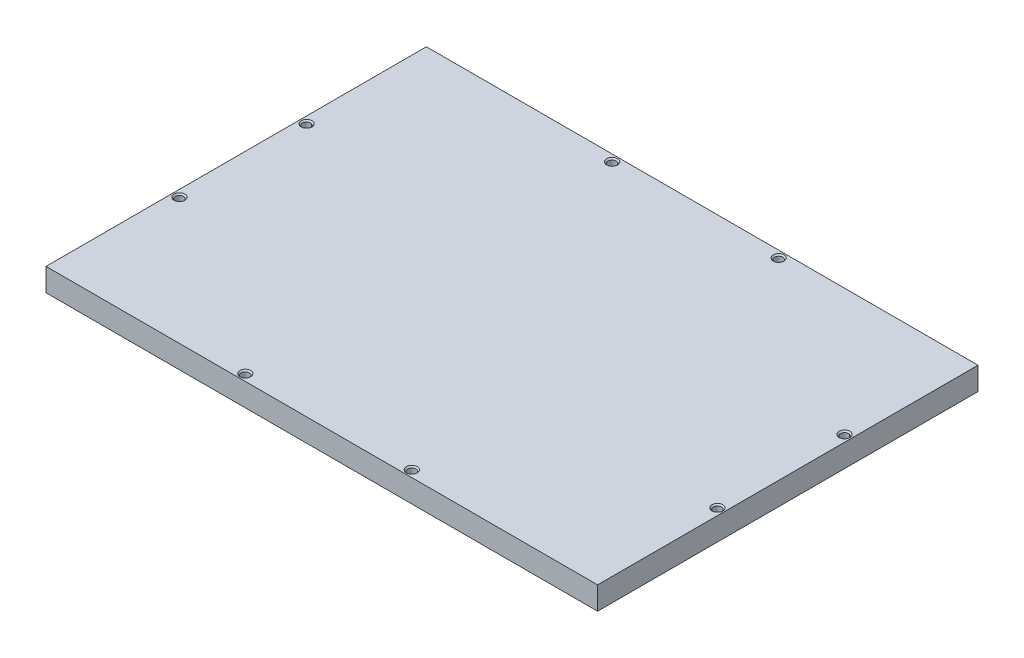
ISO-10303-21;
HEADER;
FILE_DESCRIPTION(('STEP AP214'),'2;1');
FILE_NAME('part.step','',(''),(''),'','','');
FILE_SCHEMA(('AUTOMOTIVE_DESIGN { 1 0 10303 214 1 1 1 1 }'));
ENDSEC;
DATA;
#1=APPLICATION_CONTEXT('core data for automotive mechanical design processes');
#2=APPLICATION_PROTOCOL_DEFINITION('international standard','automotive_design',2000,#1);
#3=PRODUCT_CONTEXT('',#1,'mechanical');
#4=PRODUCT('Part','Part','',(#3));
#5=PRODUCT_RELATED_PRODUCT_CATEGORY('part','',(#4));
#6=PRODUCT_DEFINITION_FORMATION('','',#4);
#7=PRODUCT_DEFINITION_CONTEXT('part definition',#1,'design');
#8=PRODUCT_DEFINITION('design','',#6,#7);
#9=PRODUCT_DEFINITION_SHAPE('','',#8);
#10=(LENGTH_UNIT() NAMED_UNIT(*) SI_UNIT(.MILLI.,.METRE.));
#11=(NAMED_UNIT(*) PLANE_ANGLE_UNIT() SI_UNIT($,.RADIAN.));
#12=(NAMED_UNIT(*) SI_UNIT($,.STERADIAN.) SOLID_ANGLE_UNIT());
#13=UNCERTAINTY_MEASURE_WITH_UNIT(LENGTH_MEASURE(1.E-05),#10,'distance_accuracy_value','');
#14=(GEOMETRIC_REPRESENTATION_CONTEXT(3) GLOBAL_UNCERTAINTY_ASSIGNED_CONTEXT((#13)) GLOBAL_UNIT_ASSIGNED_CONTEXT((#10,
#11,#12)) REPRESENTATION_CONTEXT('',''));
#15=CARTESIAN_POINT('',(0.,0.,0.));
#16=DIRECTION('',(0.,0.,1.));
#17=DIRECTION('',(1.,0.,0.));
#18=AXIS2_PLACEMENT_3D('',#15,#16,#17);
#19=CARTESIAN_POINT('',(0.,10.6873821773841,0.));
#20=DIRECTION('',(1.,0.,0.));
#21=DIRECTION('',(0.,0.,-1.));
#22=AXIS2_PLACEMENT_3D('',#19,#20,#21);
#23=PLANE('',#22);
#24=DIRECTION('',(0.,0.,1.));
#25=VECTOR('',#24,1.);
#26=CARTESIAN_POINT('',(0.,0.,0.));
#27=LINE('',#26,#25);
#28=CARTESIAN_POINT('',(0.,0.,0.));
#29=VERTEX_POINT('',#28);
#30=CARTESIAN_POINT('',(0.,0.,177.8));
#31=VERTEX_POINT('',#30);
#32=EDGE_CURVE('E120',#29,#31,#27,.T.);
#33=ORIENTED_EDGE('',*,*,#32,.T.);
#34=DIRECTION('',(0.,-1.,0.));
#35=VECTOR('',#34,1.);
#36=CARTESIAN_POINT('',(0.,10.6873821773841,177.8));
#37=LINE('',#36,#35);
#38=CARTESIAN_POINT('',(0.,10.6873821773841,177.8));
#39=VERTEX_POINT('',#38);
#40=EDGE_CURVE('E12',#39,#31,#37,.T.);
#41=ORIENTED_EDGE('',*,*,#40,.F.);
#42=DIRECTION('',(0.,0.,1.));
#43=VECTOR('',#42,1.);
#44=CARTESIAN_POINT('',(0.,10.6873821773841,0.));
#45=LINE('',#44,#43);
#46=CARTESIAN_POINT('',(0.,10.6873821773841,0.));
#47=VERTEX_POINT('',#46);
#48=EDGE_CURVE('E92',#47,#39,#45,.T.);
#49=ORIENTED_EDGE('',*,*,#48,.F.);
#50=DIRECTION('',(0.,-1.,0.));
#51=VECTOR('',#50,1.);
#52=CARTESIAN_POINT('',(0.,10.6873821773841,0.));
#53=LINE('',#52,#51);
#54=EDGE_CURVE('E103',#47,#29,#53,.T.);
#55=ORIENTED_EDGE('',*,*,#54,.T.);
#56=EDGE_LOOP('',(#33,#41,#49,#55));
#57=FACE_BOUND('',#56,.T.);
#58=ADVANCED_FACE('F41',(#57),#23,.F.);
#59=CARTESIAN_POINT('',(0.,10.6873821773841,177.8));
#60=DIRECTION('',(0.,0.,-1.));
#61=DIRECTION('',(-1.,0.,0.));
#62=AXIS2_PLACEMENT_3D('',#59,#60,#61);
#63=PLANE('',#62);
#64=DIRECTION('',(1.,0.,0.));
#65=VECTOR('',#64,1.);
#66=CARTESIAN_POINT('',(0.,0.,177.8));
#67=LINE('',#66,#65);
#68=CARTESIAN_POINT('',(257.81,0.,177.8));
#69=VERTEX_POINT('',#68);
#70=EDGE_CURVE('E97',#31,#69,#67,.T.);
#71=ORIENTED_EDGE('',*,*,#70,.T.);
#72=DIRECTION('',(0.,-1.,0.));
#73=VECTOR('',#72,1.);
#74=CARTESIAN_POINT('',(257.81,10.6873821773841,177.8));
#75=LINE('',#74,#73);
#76=CARTESIAN_POINT('',(257.81,10.6873821773841,177.8));
#77=VERTEX_POINT('',#76);
#78=EDGE_CURVE('E49',#77,#69,#75,.T.);
#79=ORIENTED_EDGE('',*,*,#78,.F.);
#80=DIRECTION('',(1.,0.,0.));
#81=VECTOR('',#80,1.);
#82=CARTESIAN_POINT('',(0.,10.6873821773841,177.8));
#83=LINE('',#82,#81);
#84=EDGE_CURVE('E87',#39,#77,#83,.T.);
#85=ORIENTED_EDGE('',*,*,#84,.F.);
#86=ORIENTED_EDGE('',*,*,#40,.T.);
#87=EDGE_LOOP('',(#71,#79,#85,#86));
#88=FACE_BOUND('',#87,.T.);
#89=ADVANCED_FACE('F96',(#88),#63,.F.);
#90=CARTESIAN_POINT('',(257.81,10.6873821773841,0.));
#91=DIRECTION('',(-1.,0.,0.));
#92=DIRECTION('',(0.,0.,1.));
#93=AXIS2_PLACEMENT_3D('',#90,#91,#92);
#94=PLANE('',#93);
#95=DIRECTION('',(0.,0.,-1.));
#96=VECTOR('',#95,1.);
#97=CARTESIAN_POINT('',(257.81,0.,0.));
#98=LINE('',#97,#96);
#99=CARTESIAN_POINT('',(257.81,0.,0.));
#100=VERTEX_POINT('',#99);
#101=EDGE_CURVE('E74',#69,#100,#98,.T.);
#102=ORIENTED_EDGE('',*,*,#101,.T.);
#103=DIRECTION('',(0.,-1.,0.));
#104=VECTOR('',#103,1.);
#105=CARTESIAN_POINT('',(257.81,10.6873821773841,0.));
#106=LINE('',#105,#104);
#107=CARTESIAN_POINT('',(257.81,10.6873821773841,0.));
#108=VERTEX_POINT('',#107);
#109=EDGE_CURVE('E98',#108,#100,#106,.T.);
#110=ORIENTED_EDGE('',*,*,#109,.F.);
#111=DIRECTION('',(0.,0.,-1.));
#112=VECTOR('',#111,1.);
#113=CARTESIAN_POINT('',(257.81,10.6873821773841,0.));
#114=LINE('',#113,#112);
#115=EDGE_CURVE('E90',#77,#108,#114,.T.);
#116=ORIENTED_EDGE('',*,*,#115,.F.);
#117=ORIENTED_EDGE('',*,*,#78,.T.);
#118=EDGE_LOOP('',(#102,#110,#116,#117));
#119=FACE_BOUND('',#118,.T.);
#120=ADVANCED_FACE('F99',(#119),#94,.F.);
#121=CARTESIAN_POINT('',(0.,10.6873821773841,0.));
#122=DIRECTION('',(0.,0.,1.));
#123=DIRECTION('',(1.,0.,0.));
#124=AXIS2_PLACEMENT_3D('',#121,#122,#123);
#125=PLANE('',#124);
#126=DIRECTION('',(-1.,0.,0.));
#127=VECTOR('',#126,1.);
#128=CARTESIAN_POINT('',(0.,0.,0.));
#129=LINE('',#128,#127);
#130=EDGE_CURVE('E80',#100,#29,#129,.T.);
#131=ORIENTED_EDGE('',*,*,#130,.T.);
#132=ORIENTED_EDGE('',*,*,#54,.F.);
#133=DIRECTION('',(-1.,0.,0.));
#134=VECTOR('',#133,1.);
#135=CARTESIAN_POINT('',(0.,10.6873821773841,0.));
#136=LINE('',#135,#134);
#137=EDGE_CURVE('E57',#108,#47,#136,.T.);
#138=ORIENTED_EDGE('',*,*,#137,.F.);
#139=ORIENTED_EDGE('',*,*,#109,.T.);
#140=EDGE_LOOP('',(#131,#132,#138,#139));
#141=FACE_BOUND('',#140,.T.);
#142=ADVANCED_FACE('F191',(#141),#125,.F.);
#143=CARTESIAN_POINT('',(0.,10.6873821773841,0.));
#144=DIRECTION('',(0.,1.,0.));
#145=DIRECTION('',(0.,0.,1.));
#146=AXIS2_PLACEMENT_3D('',#143,#144,#145);
#147=PLANE('',#146);
#148=CARTESIAN_POINT('',(3.175,10.6873821773841,59.182));
#149=DIRECTION('',(0.,1.,0.));
#150=DIRECTION('',(0.,0.,1.));
#151=AXIS2_PLACEMENT_3D('',#148,#149,#150);
#152=CIRCLE('',#151,2.53365);
#153=CARTESIAN_POINT('',(3.175,10.6873821773841,61.71565));
#154=VERTEX_POINT('',#153);
#155=EDGE_CURVE('E432',#154,#154,#152,.T.);
#156=ORIENTED_EDGE('',*,*,#155,.F.);
#157=EDGE_LOOP('',(#156));
#158=FACE_BOUND('',#157,.T.);
#159=CARTESIAN_POINT('',(89.9922,10.6873821773841,3.175));
#160=DIRECTION('',(0.,1.,0.));
#161=DIRECTION('',(0.,0.,1.));
#162=AXIS2_PLACEMENT_3D('',#159,#160,#161);
#163=CIRCLE('',#162,2.53365);
#164=CARTESIAN_POINT('',(89.9922,10.6873821773841,5.70865));
#165=VERTEX_POINT('',#164);
#166=EDGE_CURVE('E445',#165,#165,#163,.T.);
#167=ORIENTED_EDGE('',*,*,#166,.F.);
#168=EDGE_LOOP('',(#167));
#169=FACE_BOUND('',#168,.T.);
#170=CARTESIAN_POINT('',(3.175,10.6873821773841,118.618));
#171=DIRECTION('',(0.,1.,0.));
#172=DIRECTION('',(0.,0.,1.));
#173=AXIS2_PLACEMENT_3D('',#170,#171,#172);
#174=CIRCLE('',#173,2.53365);
#175=CARTESIAN_POINT('',(3.175,10.6873821773841,121.15165));
#176=VERTEX_POINT('',#175);
#177=EDGE_CURVE('E454',#176,#176,#174,.T.);
#178=ORIENTED_EDGE('',*,*,#177,.F.);
#179=EDGE_LOOP('',(#178));
#180=FACE_BOUND('',#179,.T.);
#181=CARTESIAN_POINT('',(167.8178,10.6873821773841,3.175));
#182=DIRECTION('',(0.,1.,0.));
#183=DIRECTION('',(0.,0.,1.));
#184=AXIS2_PLACEMENT_3D('',#181,#182,#183);
#185=CIRCLE('',#184,2.53365);
#186=CARTESIAN_POINT('',(167.8178,10.6873821773841,5.70865));
#187=VERTEX_POINT('',#186);
#188=EDGE_CURVE('E465',#187,#187,#185,.T.);
#189=ORIENTED_EDGE('',*,*,#188,.F.);
#190=EDGE_LOOP('',(#189));
#191=FACE_BOUND('',#190,.T.);
#192=CARTESIAN_POINT('',(254.635,10.6873821773841,59.182));
#193=DIRECTION('',(0.,1.,0.));
#194=DIRECTION('',(0.,0.,1.));
#195=AXIS2_PLACEMENT_3D('',#192,#193,#194);
#196=CIRCLE('',#195,2.53365);
#197=CARTESIAN_POINT('',(254.635,10.6873821773841,61.71565));
#198=VERTEX_POINT('',#197);
#199=EDGE_CURVE('E475',#198,#198,#196,.T.);
#200=ORIENTED_EDGE('',*,*,#199,.F.);
#201=EDGE_LOOP('',(#200));
#202=FACE_BOUND('',#201,.T.);
#203=CARTESIAN_POINT('',(254.635,10.6873821773841,118.618));
#204=DIRECTION('',(0.,1.,0.));
#205=DIRECTION('',(0.,0.,1.));
#206=AXIS2_PLACEMENT_3D('',#203,#204,#205);
#207=CIRCLE('',#206,2.53365);
#208=CARTESIAN_POINT('',(254.635,10.6873821773841,121.15165));
#209=VERTEX_POINT('',#208);
#210=EDGE_CURVE('E146',#209,#209,#207,.T.);
#211=ORIENTED_EDGE('',*,*,#210,.F.);
#212=EDGE_LOOP('',(#211));
#213=FACE_BOUND('',#212,.T.);
#214=CARTESIAN_POINT('',(167.8178,10.6873821773841,174.625));
#215=DIRECTION('',(0.,1.,0.));
#216=DIRECTION('',(0.,0.,1.));
#217=AXIS2_PLACEMENT_3D('',#214,#215,#216);
#218=CIRCLE('',#217,2.53365);
#219=CARTESIAN_POINT('',(167.8178,10.6873821773841,177.15865));
#220=VERTEX_POINT('',#219);
#221=EDGE_CURVE('E134',#220,#220,#218,.T.);
#222=ORIENTED_EDGE('',*,*,#221,.F.);
#223=EDGE_LOOP('',(#222));
#224=FACE_BOUND('',#223,.T.);
#225=CARTESIAN_POINT('',(89.9922,10.6873821773841,174.625));
#226=DIRECTION('',(0.,1.,0.));
#227=DIRECTION('',(0.,0.,1.));
#228=AXIS2_PLACEMENT_3D('',#225,#226,#227);
#229=CIRCLE('',#228,2.53365);
#230=CARTESIAN_POINT('',(89.9922,10.6873821773841,177.15865));
#231=VERTEX_POINT('',#230);
#232=EDGE_CURVE('E123',#231,#231,#229,.T.);
#233=ORIENTED_EDGE('',*,*,#232,.F.);
#234=EDGE_LOOP('',(#233));
#235=FACE_BOUND('',#234,.T.);
#236=ORIENTED_EDGE('',*,*,#48,.T.);
#237=ORIENTED_EDGE('',*,*,#84,.T.);
#238=ORIENTED_EDGE('',*,*,#115,.T.);
#239=ORIENTED_EDGE('',*,*,#137,.T.);
#240=EDGE_LOOP('',(#236,#237,#238,#239));
#241=FACE_BOUND('',#240,.T.);
#242=ADVANCED_FACE('F88',(#158,#169,#180,#191,#202,#213,#224,#235,#241),#147,.T.);
#243=CARTESIAN_POINT('',(0.,0.,0.));
#244=DIRECTION('',(0.,1.,0.));
#245=DIRECTION('',(0.,0.,1.));
#246=AXIS2_PLACEMENT_3D('',#243,#244,#245);
#247=PLANE('',#246);
#248=CARTESIAN_POINT('',(3.175,0.,59.182));
#249=DIRECTION('',(0.,1.,0.));
#250=DIRECTION('',(0.,0.,1.));
#251=AXIS2_PLACEMENT_3D('',#248,#249,#250);
#252=CIRCLE('',#251,1.89865);
#253=CARTESIAN_POINT('',(3.175,0.,61.08065));
#254=VERTEX_POINT('',#253);
#255=EDGE_CURVE('E436',#254,#254,#252,.T.);
#256=ORIENTED_EDGE('',*,*,#255,.T.);
#257=EDGE_LOOP('',(#256));
#258=FACE_BOUND('',#257,.T.);
#259=CARTESIAN_POINT('',(89.9922,0.,3.175));
#260=DIRECTION('',(0.,1.,0.));
#261=DIRECTION('',(0.,0.,1.));
#262=AXIS2_PLACEMENT_3D('',#259,#260,#261);
#263=CIRCLE('',#262,1.89865);
#264=CARTESIAN_POINT('',(89.9922,0.,5.07365));
#265=VERTEX_POINT('',#264);
#266=EDGE_CURVE('E452',#265,#265,#263,.T.);
#267=ORIENTED_EDGE('',*,*,#266,.T.);
#268=EDGE_LOOP('',(#267));
#269=FACE_BOUND('',#268,.T.);
#270=CARTESIAN_POINT('',(3.175,0.,118.618));
#271=DIRECTION('',(0.,1.,0.));
#272=DIRECTION('',(0.,0.,1.));
#273=AXIS2_PLACEMENT_3D('',#270,#271,#272);
#274=CIRCLE('',#273,1.89865);
#275=CARTESIAN_POINT('',(3.175,0.,120.51665));
#276=VERTEX_POINT('',#275);
#277=EDGE_CURVE('E462',#276,#276,#274,.T.);
#278=ORIENTED_EDGE('',*,*,#277,.T.);
#279=EDGE_LOOP('',(#278));
#280=FACE_BOUND('',#279,.T.);
#281=CARTESIAN_POINT('',(167.8178,0.,3.175));
#282=DIRECTION('',(0.,1.,0.));
#283=DIRECTION('',(0.,0.,1.));
#284=AXIS2_PLACEMENT_3D('',#281,#282,#283);
#285=CIRCLE('',#284,1.89865);
#286=CARTESIAN_POINT('',(167.8178,0.,5.07365));
#287=VERTEX_POINT('',#286);
#288=EDGE_CURVE('E473',#287,#287,#285,.T.);
#289=ORIENTED_EDGE('',*,*,#288,.T.);
#290=EDGE_LOOP('',(#289));
#291=FACE_BOUND('',#290,.T.);
#292=CARTESIAN_POINT('',(254.635,0.,59.182));
#293=DIRECTION('',(0.,1.,0.));
#294=DIRECTION('',(0.,0.,1.));
#295=AXIS2_PLACEMENT_3D('',#292,#293,#294);
#296=CIRCLE('',#295,1.89865);
#297=CARTESIAN_POINT('',(254.635,0.,61.08065));
#298=VERTEX_POINT('',#297);
#299=EDGE_CURVE('E152',#298,#298,#296,.T.);
#300=ORIENTED_EDGE('',*,*,#299,.T.);
#301=EDGE_LOOP('',(#300));
#302=FACE_BOUND('',#301,.T.);
#303=CARTESIAN_POINT('',(254.635,0.,118.618));
#304=DIRECTION('',(0.,1.,0.));
#305=DIRECTION('',(0.,0.,1.));
#306=AXIS2_PLACEMENT_3D('',#303,#304,#305);
#307=CIRCLE('',#306,1.89865);
#308=CARTESIAN_POINT('',(254.635,0.,120.51665));
#309=VERTEX_POINT('',#308);
#310=EDGE_CURVE('E139',#309,#309,#307,.T.);
#311=ORIENTED_EDGE('',*,*,#310,.T.);
#312=EDGE_LOOP('',(#311));
#313=FACE_BOUND('',#312,.T.);
#314=CARTESIAN_POINT('',(167.8178,0.,174.625));
#315=DIRECTION('',(0.,1.,0.));
#316=DIRECTION('',(0.,0.,1.));
#317=AXIS2_PLACEMENT_3D('',#314,#315,#316);
#318=CIRCLE('',#317,1.89865);
#319=CARTESIAN_POINT('',(167.8178,0.,176.52365));
#320=VERTEX_POINT('',#319);
#321=EDGE_CURVE('E128',#320,#320,#318,.T.);
#322=ORIENTED_EDGE('',*,*,#321,.T.);
#323=EDGE_LOOP('',(#322));
#324=FACE_BOUND('',#323,.T.);
#325=CARTESIAN_POINT('',(89.9922,0.,174.625));
#326=DIRECTION('',(0.,1.,0.));
#327=DIRECTION('',(0.,0.,1.));
#328=AXIS2_PLACEMENT_3D('',#325,#326,#327);
#329=CIRCLE('',#328,1.89865);
#330=CARTESIAN_POINT('',(89.9922,0.,176.52365));
#331=VERTEX_POINT('',#330);
#332=EDGE_CURVE('E117',#331,#331,#329,.T.);
#333=ORIENTED_EDGE('',*,*,#332,.T.);
#334=EDGE_LOOP('',(#333));
#335=FACE_BOUND('',#334,.T.);
#336=ORIENTED_EDGE('',*,*,#32,.F.);
#337=ORIENTED_EDGE('',*,*,#130,.F.);
#338=ORIENTED_EDGE('',*,*,#101,.F.);
#339=ORIENTED_EDGE('',*,*,#70,.F.);
#340=EDGE_LOOP('',(#336,#337,#338,#339));
#341=FACE_BOUND('',#340,.T.);
#342=ADVANCED_FACE('F160',(#258,#269,#280,#291,#302,#313,#324,#335,#341),#247,.F.);
#343=CARTESIAN_POINT('',(89.9922,10.6873821773841,174.625));
#344=DIRECTION('',(0.,1.,0.));
#345=DIRECTION('',(0.,0.,1.));
#346=AXIS2_PLACEMENT_3D('',#343,#344,#345);
#347=CYLINDRICAL_SURFACE('',#346,1.89865);
#348=ORIENTED_EDGE('',*,*,#332,.F.);
#349=EDGE_LOOP('',(#348));
#350=FACE_BOUND('',#349,.T.);
#351=CARTESIAN_POINT('',(89.9922,10.0523821773841,174.625));
#352=DIRECTION('',(0.,1.,0.));
#353=DIRECTION('',(0.,0.,1.));
#354=AXIS2_PLACEMENT_3D('',#351,#352,#353);
#355=CIRCLE('',#354,1.89865);
#356=CARTESIAN_POINT('',(89.9922,10.0523821773841,176.52365));
#357=VERTEX_POINT('',#356);
#358=EDGE_CURVE('E121',#357,#357,#355,.T.);
#359=ORIENTED_EDGE('',*,*,#358,.T.);
#360=EDGE_LOOP('',(#359));
#361=FACE_BOUND('',#360,.T.);
#362=ADVANCED_FACE('F193',(#350,#361),#347,.F.);
#363=CARTESIAN_POINT('',(89.9922,10.6873821773841,174.625));
#364=DIRECTION('',(0.,1.,0.));
#365=DIRECTION('',(0.,0.,1.));
#366=AXIS2_PLACEMENT_3D('',#363,#364,#365);
#367=CONICAL_SURFACE('',#366,2.53365,0.785398163397444);
#368=ORIENTED_EDGE('',*,*,#358,.F.);
#369=EDGE_LOOP('',(#368));
#370=FACE_BOUND('',#369,.T.);
#371=ORIENTED_EDGE('',*,*,#232,.T.);
#372=EDGE_LOOP('',(#371));
#373=FACE_BOUND('',#372,.T.);
#374=ADVANCED_FACE('F200',(#370,#373),#367,.F.);
#375=CARTESIAN_POINT('',(167.8178,10.6873821773841,174.625));
#376=DIRECTION('',(0.,1.,0.));
#377=DIRECTION('',(0.,0.,1.));
#378=AXIS2_PLACEMENT_3D('',#375,#376,#377);
#379=CYLINDRICAL_SURFACE('',#378,1.89865);
#380=ORIENTED_EDGE('',*,*,#321,.F.);
#381=EDGE_LOOP('',(#380));
#382=FACE_BOUND('',#381,.T.);
#383=CARTESIAN_POINT('',(167.8178,10.0523821773841,174.625));
#384=DIRECTION('',(0.,1.,0.));
#385=DIRECTION('',(0.,0.,1.));
#386=AXIS2_PLACEMENT_3D('',#383,#384,#385);
#387=CIRCLE('',#386,1.89865);
#388=CARTESIAN_POINT('',(167.8178,10.0523821773841,176.52365));
#389=VERTEX_POINT('',#388);
#390=EDGE_CURVE('E131',#389,#389,#387,.T.);
#391=ORIENTED_EDGE('',*,*,#390,.T.);
#392=EDGE_LOOP('',(#391));
#393=FACE_BOUND('',#392,.T.);
#394=ADVANCED_FACE('F175',(#382,#393),#379,.F.);
#395=CARTESIAN_POINT('',(167.8178,10.6873821773841,174.625));
#396=DIRECTION('',(0.,1.,0.));
#397=DIRECTION('',(0.,0.,1.));
#398=AXIS2_PLACEMENT_3D('',#395,#396,#397);
#399=CONICAL_SURFACE('',#398,2.53365,0.785398163397444);
#400=ORIENTED_EDGE('',*,*,#390,.F.);
#401=EDGE_LOOP('',(#400));
#402=FACE_BOUND('',#401,.T.);
#403=ORIENTED_EDGE('',*,*,#221,.T.);
#404=EDGE_LOOP('',(#403));
#405=FACE_BOUND('',#404,.T.);
#406=ADVANCED_FACE('F166',(#402,#405),#399,.F.);
#407=CARTESIAN_POINT('',(254.635,10.6873821773841,118.618));
#408=DIRECTION('',(0.,1.,0.));
#409=DIRECTION('',(0.,0.,1.));
#410=AXIS2_PLACEMENT_3D('',#407,#408,#409);
#411=CYLINDRICAL_SURFACE('',#410,1.89865);
#412=ORIENTED_EDGE('',*,*,#310,.F.);
#413=EDGE_LOOP('',(#412));
#414=FACE_BOUND('',#413,.T.);
#415=CARTESIAN_POINT('',(254.635,10.0523821773841,118.618));
#416=DIRECTION('',(0.,1.,0.));
#417=DIRECTION('',(0.,0.,1.));
#418=AXIS2_PLACEMENT_3D('',#415,#416,#417);
#419=CIRCLE('',#418,1.89865);
#420=CARTESIAN_POINT('',(254.635,10.0523821773841,120.51665));
#421=VERTEX_POINT('',#420);
#422=EDGE_CURVE('E151',#421,#421,#419,.T.);
#423=ORIENTED_EDGE('',*,*,#422,.T.);
#424=EDGE_LOOP('',(#423));
#425=FACE_BOUND('',#424,.T.);
#426=ADVANCED_FACE('F163',(#414,#425),#411,.F.);
#427=CARTESIAN_POINT('',(254.635,10.6873821773841,118.618));
#428=DIRECTION('',(0.,1.,0.));
#429=DIRECTION('',(0.,0.,1.));
#430=AXIS2_PLACEMENT_3D('',#427,#428,#429);
#431=CONICAL_SURFACE('',#430,2.53365,0.785398163397444);
#432=ORIENTED_EDGE('',*,*,#422,.F.);
#433=EDGE_LOOP('',(#432));
#434=FACE_BOUND('',#433,.T.);
#435=ORIENTED_EDGE('',*,*,#210,.T.);
#436=EDGE_LOOP('',(#435));
#437=FACE_BOUND('',#436,.T.);
#438=ADVANCED_FACE('F165',(#434,#437),#431,.F.);
#439=CARTESIAN_POINT('',(254.635,10.6873821773841,59.182));
#440=DIRECTION('',(0.,1.,0.));
#441=DIRECTION('',(0.,0.,1.));
#442=AXIS2_PLACEMENT_3D('',#439,#440,#441);
#443=CYLINDRICAL_SURFACE('',#442,1.89865);
#444=ORIENTED_EDGE('',*,*,#299,.F.);
#445=EDGE_LOOP('',(#444));
#446=FACE_BOUND('',#445,.T.);
#447=CARTESIAN_POINT('',(254.635,10.0523821773841,59.182));
#448=DIRECTION('',(0.,1.,0.));
#449=DIRECTION('',(0.,0.,1.));
#450=AXIS2_PLACEMENT_3D('',#447,#448,#449);
#451=CIRCLE('',#450,1.89865);
#452=CARTESIAN_POINT('',(254.635,10.0523821773841,61.08065));
#453=VERTEX_POINT('',#452);
#454=EDGE_CURVE('E479',#453,#453,#451,.T.);
#455=ORIENTED_EDGE('',*,*,#454,.T.);
#456=EDGE_LOOP('',(#455));
#457=FACE_BOUND('',#456,.T.);
#458=ADVANCED_FACE('F172',(#446,#457),#443,.F.);
#459=CARTESIAN_POINT('',(254.635,10.6873821773841,59.182));
#460=DIRECTION('',(0.,1.,0.));
#461=DIRECTION('',(0.,0.,1.));
#462=AXIS2_PLACEMENT_3D('',#459,#460,#461);
#463=CONICAL_SURFACE('',#462,2.53365,0.785398163397444);
#464=ORIENTED_EDGE('',*,*,#454,.F.);
#465=EDGE_LOOP('',(#464));
#466=FACE_BOUND('',#465,.T.);
#467=ORIENTED_EDGE('',*,*,#199,.T.);
#468=EDGE_LOOP('',(#467));
#469=FACE_BOUND('',#468,.T.);
#470=ADVANCED_FACE('F284',(#466,#469),#463,.F.);
#471=CARTESIAN_POINT('',(167.8178,10.6873821773841,3.175));
#472=DIRECTION('',(0.,1.,0.));
#473=DIRECTION('',(0.,0.,1.));
#474=AXIS2_PLACEMENT_3D('',#471,#472,#473);
#475=CYLINDRICAL_SURFACE('',#474,1.89865);
#476=ORIENTED_EDGE('',*,*,#288,.F.);
#477=EDGE_LOOP('',(#476));
#478=FACE_BOUND('',#477,.T.);
#479=CARTESIAN_POINT('',(167.8178,10.0523821773841,3.175));
#480=DIRECTION('',(0.,1.,0.));
#481=DIRECTION('',(0.,0.,1.));
#482=AXIS2_PLACEMENT_3D('',#479,#480,#481);
#483=CIRCLE('',#482,1.89865);
#484=CARTESIAN_POINT('',(167.8178,10.0523821773841,5.07365));
#485=VERTEX_POINT('',#484);
#486=EDGE_CURVE('E470',#485,#485,#483,.T.);
#487=ORIENTED_EDGE('',*,*,#486,.T.);
#488=EDGE_LOOP('',(#487));
#489=FACE_BOUND('',#488,.T.);
#490=ADVANCED_FACE('F295',(#478,#489),#475,.F.);
#491=CARTESIAN_POINT('',(167.8178,10.6873821773841,3.175));
#492=DIRECTION('',(0.,1.,0.));
#493=DIRECTION('',(0.,0.,1.));
#494=AXIS2_PLACEMENT_3D('',#491,#492,#493);
#495=CONICAL_SURFACE('',#494,2.53365,0.785398163397444);
#496=ORIENTED_EDGE('',*,*,#486,.F.);
#497=EDGE_LOOP('',(#496));
#498=FACE_BOUND('',#497,.T.);
#499=ORIENTED_EDGE('',*,*,#188,.T.);
#500=EDGE_LOOP('',(#499));
#501=FACE_BOUND('',#500,.T.);
#502=ADVANCED_FACE('F306',(#498,#501),#495,.F.);
#503=CARTESIAN_POINT('',(3.175,10.6873821773841,118.618));
#504=DIRECTION('',(0.,1.,0.));
#505=DIRECTION('',(0.,0.,1.));
#506=AXIS2_PLACEMENT_3D('',#503,#504,#505);
#507=CYLINDRICAL_SURFACE('',#506,1.89865);
#508=ORIENTED_EDGE('',*,*,#277,.F.);
#509=EDGE_LOOP('',(#508));
#510=FACE_BOUND('',#509,.T.);
#511=CARTESIAN_POINT('',(3.175,10.0523821773841,118.618));
#512=DIRECTION('',(0.,1.,0.));
#513=DIRECTION('',(0.,0.,1.));
#514=AXIS2_PLACEMENT_3D('',#511,#512,#513);
#515=CIRCLE('',#514,1.89865);
#516=CARTESIAN_POINT('',(3.175,10.0523821773841,120.51665));
#517=VERTEX_POINT('',#516);
#518=EDGE_CURVE('E459',#517,#517,#515,.T.);
#519=ORIENTED_EDGE('',*,*,#518,.T.);
#520=EDGE_LOOP('',(#519));
#521=FACE_BOUND('',#520,.T.);
#522=ADVANCED_FACE('F317',(#510,#521),#507,.F.);
#523=CARTESIAN_POINT('',(3.175,10.6873821773841,118.618));
#524=DIRECTION('',(0.,1.,0.));
#525=DIRECTION('',(0.,0.,1.));
#526=AXIS2_PLACEMENT_3D('',#523,#524,#525);
#527=CONICAL_SURFACE('',#526,2.53365,0.785398163397448);
#528=ORIENTED_EDGE('',*,*,#518,.F.);
#529=EDGE_LOOP('',(#528));
#530=FACE_BOUND('',#529,.T.);
#531=ORIENTED_EDGE('',*,*,#177,.T.);
#532=EDGE_LOOP('',(#531));
#533=FACE_BOUND('',#532,.T.);
#534=ADVANCED_FACE('F328',(#530,#533),#527,.F.);
#535=CARTESIAN_POINT('',(89.9922,10.6873821773841,3.175));
#536=DIRECTION('',(0.,1.,0.));
#537=DIRECTION('',(0.,0.,1.));
#538=AXIS2_PLACEMENT_3D('',#535,#536,#537);
#539=CYLINDRICAL_SURFACE('',#538,1.89865);
#540=ORIENTED_EDGE('',*,*,#266,.F.);
#541=EDGE_LOOP('',(#540));
#542=FACE_BOUND('',#541,.T.);
#543=CARTESIAN_POINT('',(89.9922,10.0523821773841,3.175));
#544=DIRECTION('',(0.,1.,0.));
#545=DIRECTION('',(0.,0.,1.));
#546=AXIS2_PLACEMENT_3D('',#543,#544,#545);
#547=CIRCLE('',#546,1.89865);
#548=CARTESIAN_POINT('',(89.9922,10.0523821773841,5.07365));
#549=VERTEX_POINT('',#548);
#550=EDGE_CURVE('E449',#549,#549,#547,.T.);
#551=ORIENTED_EDGE('',*,*,#550,.T.);
#552=EDGE_LOOP('',(#551));
#553=FACE_BOUND('',#552,.T.);
#554=ADVANCED_FACE('F339',(#542,#553),#539,.F.);
#555=CARTESIAN_POINT('',(89.9922,10.6873821773841,3.175));
#556=DIRECTION('',(0.,1.,0.));
#557=DIRECTION('',(0.,0.,1.));
#558=AXIS2_PLACEMENT_3D('',#555,#556,#557);
#559=CONICAL_SURFACE('',#558,2.53365,0.785398163397444);
#560=ORIENTED_EDGE('',*,*,#550,.F.);
#561=EDGE_LOOP('',(#560));
#562=FACE_BOUND('',#561,.T.);
#563=ORIENTED_EDGE('',*,*,#166,.T.);
#564=EDGE_LOOP('',(#563));
#565=FACE_BOUND('',#564,.T.);
#566=ADVANCED_FACE('F350',(#562,#565),#559,.F.);
#567=CARTESIAN_POINT('',(3.175,10.6873821773841,59.182));
#568=DIRECTION('',(0.,1.,0.));
#569=DIRECTION('',(0.,0.,1.));
#570=AXIS2_PLACEMENT_3D('',#567,#568,#569);
#571=CYLINDRICAL_SURFACE('',#570,1.89865);
#572=ORIENTED_EDGE('',*,*,#255,.F.);
#573=EDGE_LOOP('',(#572));
#574=FACE_BOUND('',#573,.T.);
#575=CARTESIAN_POINT('',(3.175,10.0523821773841,59.182));
#576=DIRECTION('',(0.,1.,0.));
#577=DIRECTION('',(0.,0.,1.));
#578=AXIS2_PLACEMENT_3D('',#575,#576,#577);
#579=CIRCLE('',#578,1.89865);
#580=CARTESIAN_POINT('',(3.175,10.0523821773841,61.08065));
#581=VERTEX_POINT('',#580);
#582=EDGE_CURVE('E429',#581,#581,#579,.T.);
#583=ORIENTED_EDGE('',*,*,#582,.T.);
#584=EDGE_LOOP('',(#583));
#585=FACE_BOUND('',#584,.T.);
#586=ADVANCED_FACE('F361',(#574,#585),#571,.F.);
#587=CARTESIAN_POINT('',(3.175,10.6873821773841,59.182));
#588=DIRECTION('',(0.,1.,0.));
#589=DIRECTION('',(0.,0.,1.));
#590=AXIS2_PLACEMENT_3D('',#587,#588,#589);
#591=CONICAL_SURFACE('',#590,2.53365,0.785398163397448);
#592=ORIENTED_EDGE('',*,*,#582,.F.);
#593=EDGE_LOOP('',(#592));
#594=FACE_BOUND('',#593,.T.);
#595=ORIENTED_EDGE('',*,*,#155,.T.);
#596=EDGE_LOOP('',(#595));
#597=FACE_BOUND('',#596,.T.);
#598=ADVANCED_FACE('F372',(#594,#597),#591,.F.);
#599=CLOSED_SHELL('',(#58,#89,#120,#142,#242,#342,#362,#374,#394,#406,#426,#438,#458,#470,#490,
#502,#522,#534,#554,#566,#586,#598));
#600=MANIFOLD_SOLID_BREP('B2',#599);
#601=ADVANCED_BREP_SHAPE_REPRESENTATION('',(#18,#600),#14);
#602=SHAPE_DEFINITION_REPRESENTATION(#9,#601);
ENDSEC;
END-ISO-10303-21;
